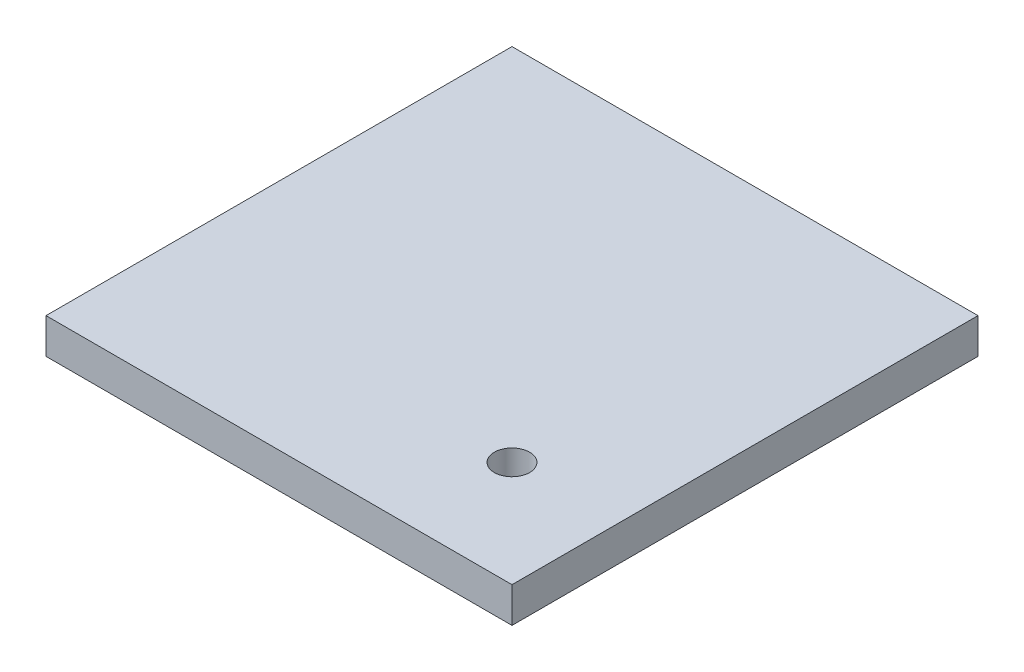
ISO-10303-21;
HEADER;
FILE_DESCRIPTION(('STEP AP214'),'2;1');
FILE_NAME('part.step','',(''),(''),'','','');
FILE_SCHEMA(('AUTOMOTIVE_DESIGN { 1 0 10303 214 1 1 1 1 }'));
ENDSEC;
DATA;
#1=APPLICATION_CONTEXT('core data for automotive mechanical design processes');
#2=APPLICATION_PROTOCOL_DEFINITION('international standard','automotive_design',2000,#1);
#3=PRODUCT_CONTEXT('',#1,'mechanical');
#4=PRODUCT('Part','Part','',(#3));
#5=PRODUCT_RELATED_PRODUCT_CATEGORY('part','',(#4));
#6=PRODUCT_DEFINITION_FORMATION('','',#4);
#7=PRODUCT_DEFINITION_CONTEXT('part definition',#1,'design');
#8=PRODUCT_DEFINITION('design','',#6,#7);
#9=PRODUCT_DEFINITION_SHAPE('','',#8);
#10=(LENGTH_UNIT() NAMED_UNIT(*) SI_UNIT(.MILLI.,.METRE.));
#11=(NAMED_UNIT(*) PLANE_ANGLE_UNIT() SI_UNIT($,.RADIAN.));
#12=(NAMED_UNIT(*) SI_UNIT($,.STERADIAN.) SOLID_ANGLE_UNIT());
#13=UNCERTAINTY_MEASURE_WITH_UNIT(LENGTH_MEASURE(1.E-05),#10,'distance_accuracy_value','');
#14=(GEOMETRIC_REPRESENTATION_CONTEXT(3) GLOBAL_UNCERTAINTY_ASSIGNED_CONTEXT((#13)) GLOBAL_UNIT_ASSIGNED_CONTEXT((#10,
#11,#12)) REPRESENTATION_CONTEXT('',''));
#15=CARTESIAN_POINT('',(0.,0.,0.));
#16=DIRECTION('',(0.,0.,1.));
#17=DIRECTION('',(1.,0.,0.));
#18=AXIS2_PLACEMENT_3D('',#15,#16,#17);
#19=CARTESIAN_POINT('',(0.,5.,0.));
#20=DIRECTION('',(0.,-1.,0.));
#21=DIRECTION('',(0.,0.,-1.));
#22=AXIS2_PLACEMENT_3D('',#19,#20,#21);
#23=PLANE('',#22);
#24=DIRECTION('',(0.,0.,1.));
#25=VECTOR('',#24,1.);
#26=CARTESIAN_POINT('',(0.,5.,0.));
#27=LINE('',#26,#25);
#28=CARTESIAN_POINT('',(0.,5.,-66.));
#29=VERTEX_POINT('',#28);
#30=CARTESIAN_POINT('',(0.,5.,0.));
#31=VERTEX_POINT('',#30);
#32=EDGE_CURVE('E85',#29,#31,#27,.T.);
#33=ORIENTED_EDGE('',*,*,#32,.T.);
#34=DIRECTION('',(1.,0.,0.));
#35=VECTOR('',#34,1.);
#36=CARTESIAN_POINT('',(0.,5.,0.));
#37=LINE('',#36,#35);
#38=CARTESIAN_POINT('',(66.,5.,0.));
#39=VERTEX_POINT('',#38);
#40=EDGE_CURVE('E80',#31,#39,#37,.T.);
#41=ORIENTED_EDGE('',*,*,#40,.T.);
#42=DIRECTION('',(0.,0.,-1.));
#43=VECTOR('',#42,1.);
#44=CARTESIAN_POINT('',(66.,5.,0.));
#45=LINE('',#44,#43);
#46=CARTESIAN_POINT('',(66.,5.,-66.));
#47=VERTEX_POINT('',#46);
#48=EDGE_CURVE('E83',#39,#47,#45,.T.);
#49=ORIENTED_EDGE('',*,*,#48,.T.);
#50=DIRECTION('',(-1.,0.,0.));
#51=VECTOR('',#50,1.);
#52=CARTESIAN_POINT('',(0.,5.,-66.));
#53=LINE('',#52,#51);
#54=EDGE_CURVE('E50',#47,#29,#53,.T.);
#55=ORIENTED_EDGE('',*,*,#54,.T.);
#56=EDGE_LOOP('',(#33,#41,#49,#55));
#57=FACE_BOUND('',#56,.T.);
#58=CARTESIAN_POINT('',(51.,5.,-15.));
#59=DIRECTION('',(0.,1.,0.));
#60=DIRECTION('',(0.,0.,1.));
#61=AXIS2_PLACEMENT_3D('',#58,#59,#60);
#62=CIRCLE('',#61,2.5);
#63=CARTESIAN_POINT('',(51.,5.,-12.5));
#64=VERTEX_POINT('',#63);
#65=EDGE_CURVE('E100',#64,#64,#62,.T.);
#66=ORIENTED_EDGE('',*,*,#65,.F.);
#67=EDGE_LOOP('',(#66));
#68=FACE_BOUND('',#67,.T.);
#69=ADVANCED_FACE('F33',(#57,#68),#23,.F.);
#70=CARTESIAN_POINT('',(0.,0.,0.));
#71=DIRECTION('',(0.,-1.,0.));
#72=DIRECTION('',(0.,0.,-1.));
#73=AXIS2_PLACEMENT_3D('',#70,#71,#72);
#74=PLANE('',#73);
#75=DIRECTION('',(0.,0.,1.));
#76=VECTOR('',#75,1.);
#77=CARTESIAN_POINT('',(0.,0.,0.));
#78=LINE('',#77,#76);
#79=CARTESIAN_POINT('',(0.,0.,-66.));
#80=VERTEX_POINT('',#79);
#81=CARTESIAN_POINT('',(0.,0.,0.));
#82=VERTEX_POINT('',#81);
#83=EDGE_CURVE('E97',#80,#82,#78,.T.);
#84=ORIENTED_EDGE('',*,*,#83,.F.);
#85=DIRECTION('',(-1.,0.,0.));
#86=VECTOR('',#85,1.);
#87=CARTESIAN_POINT('',(0.,0.,-66.));
#88=LINE('',#87,#86);
#89=CARTESIAN_POINT('',(66.,0.,-66.));
#90=VERTEX_POINT('',#89);
#91=EDGE_CURVE('E73',#90,#80,#88,.T.);
#92=ORIENTED_EDGE('',*,*,#91,.F.);
#93=DIRECTION('',(0.,0.,-1.));
#94=VECTOR('',#93,1.);
#95=CARTESIAN_POINT('',(66.,0.,0.));
#96=LINE('',#95,#94);
#97=CARTESIAN_POINT('',(66.,0.,0.));
#98=VERTEX_POINT('',#97);
#99=EDGE_CURVE('E67',#98,#90,#96,.T.);
#100=ORIENTED_EDGE('',*,*,#99,.F.);
#101=DIRECTION('',(1.,0.,0.));
#102=VECTOR('',#101,1.);
#103=CARTESIAN_POINT('',(0.,0.,0.));
#104=LINE('',#103,#102);
#105=EDGE_CURVE('E89',#82,#98,#104,.T.);
#106=ORIENTED_EDGE('',*,*,#105,.F.);
#107=EDGE_LOOP('',(#84,#92,#100,#106));
#108=FACE_BOUND('',#107,.T.);
#109=CARTESIAN_POINT('',(51.,0.,-15.));
#110=DIRECTION('',(0.,1.,0.));
#111=DIRECTION('',(0.,0.,1.));
#112=AXIS2_PLACEMENT_3D('',#109,#110,#111);
#113=CIRCLE('',#112,2.5);
#114=CARTESIAN_POINT('',(51.,0.,-12.5));
#115=VERTEX_POINT('',#114);
#116=EDGE_CURVE('E112',#115,#115,#113,.T.);
#117=ORIENTED_EDGE('',*,*,#116,.T.);
#118=EDGE_LOOP('',(#117));
#119=FACE_BOUND('',#118,.T.);
#120=ADVANCED_FACE('F108',(#108,#119),#74,.T.);
#121=CARTESIAN_POINT('',(0.,5.,0.));
#122=DIRECTION('',(1.,0.,0.));
#123=DIRECTION('',(0.,0.,-1.));
#124=AXIS2_PLACEMENT_3D('',#121,#122,#123);
#125=PLANE('',#124);
#126=ORIENTED_EDGE('',*,*,#83,.T.);
#127=DIRECTION('',(0.,-1.,0.));
#128=VECTOR('',#127,1.);
#129=CARTESIAN_POINT('',(0.,5.,0.));
#130=LINE('',#129,#128);
#131=EDGE_CURVE('E11',#31,#82,#130,.T.);
#132=ORIENTED_EDGE('',*,*,#131,.F.);
#133=ORIENTED_EDGE('',*,*,#32,.F.);
#134=DIRECTION('',(0.,-1.,0.));
#135=VECTOR('',#134,1.);
#136=CARTESIAN_POINT('',(0.,5.,-66.));
#137=LINE('',#136,#135);
#138=EDGE_CURVE('E93',#29,#80,#137,.T.);
#139=ORIENTED_EDGE('',*,*,#138,.T.);
#140=EDGE_LOOP('',(#126,#132,#133,#139));
#141=FACE_BOUND('',#140,.T.);
#142=ADVANCED_FACE('F35',(#141),#125,.F.);
#143=CARTESIAN_POINT('',(0.,5.,0.));
#144=DIRECTION('',(0.,0.,-1.));
#145=DIRECTION('',(-1.,0.,0.));
#146=AXIS2_PLACEMENT_3D('',#143,#144,#145);
#147=PLANE('',#146);
#148=ORIENTED_EDGE('',*,*,#105,.T.);
#149=DIRECTION('',(0.,-1.,0.));
#150=VECTOR('',#149,1.);
#151=CARTESIAN_POINT('',(66.,5.,0.));
#152=LINE('',#151,#150);
#153=EDGE_CURVE('E42',#39,#98,#152,.T.);
#154=ORIENTED_EDGE('',*,*,#153,.F.);
#155=ORIENTED_EDGE('',*,*,#40,.F.);
#156=ORIENTED_EDGE('',*,*,#131,.T.);
#157=EDGE_LOOP('',(#148,#154,#155,#156));
#158=FACE_BOUND('',#157,.T.);
#159=ADVANCED_FACE('F88',(#158),#147,.F.);
#160=CARTESIAN_POINT('',(66.,5.,0.));
#161=DIRECTION('',(-1.,0.,0.));
#162=DIRECTION('',(0.,0.,1.));
#163=AXIS2_PLACEMENT_3D('',#160,#161,#162);
#164=PLANE('',#163);
#165=ORIENTED_EDGE('',*,*,#99,.T.);
#166=DIRECTION('',(0.,-1.,0.));
#167=VECTOR('',#166,1.);
#168=CARTESIAN_POINT('',(66.,5.,-66.));
#169=LINE('',#168,#167);
#170=EDGE_CURVE('E90',#47,#90,#169,.T.);
#171=ORIENTED_EDGE('',*,*,#170,.F.);
#172=ORIENTED_EDGE('',*,*,#48,.F.);
#173=ORIENTED_EDGE('',*,*,#153,.T.);
#174=EDGE_LOOP('',(#165,#171,#172,#173));
#175=FACE_BOUND('',#174,.T.);
#176=ADVANCED_FACE('F91',(#175),#164,.F.);
#177=CARTESIAN_POINT('',(0.,5.,-66.));
#178=DIRECTION('',(0.,0.,1.));
#179=DIRECTION('',(1.,0.,0.));
#180=AXIS2_PLACEMENT_3D('',#177,#178,#179);
#181=PLANE('',#180);
#182=ORIENTED_EDGE('',*,*,#91,.T.);
#183=ORIENTED_EDGE('',*,*,#138,.F.);
#184=ORIENTED_EDGE('',*,*,#54,.F.);
#185=ORIENTED_EDGE('',*,*,#170,.T.);
#186=EDGE_LOOP('',(#182,#183,#184,#185));
#187=FACE_BOUND('',#186,.T.);
#188=ADVANCED_FACE('F105',(#187),#181,.F.);
#189=CARTESIAN_POINT('',(51.,5.,-15.));
#190=DIRECTION('',(0.,-1.,0.));
#191=DIRECTION('',(0.,0.,-1.));
#192=AXIS2_PLACEMENT_3D('',#189,#190,#191);
#193=CYLINDRICAL_SURFACE('',#192,2.5);
#194=ORIENTED_EDGE('',*,*,#65,.T.);
#195=EDGE_LOOP('',(#194));
#196=FACE_BOUND('',#195,.T.);
#197=ORIENTED_EDGE('',*,*,#116,.F.);
#198=EDGE_LOOP('',(#197));
#199=FACE_BOUND('',#198,.T.);
#200=ADVANCED_FACE('F118',(#196,#199),#193,.F.);
#201=CLOSED_SHELL('',(#69,#120,#142,#159,#176,#188,#200));
#202=MANIFOLD_SOLID_BREP('B2',#201);
#203=ADVANCED_BREP_SHAPE_REPRESENTATION('',(#18,#202),#14);
#204=SHAPE_DEFINITION_REPRESENTATION(#9,#203);
ENDSEC;
END-ISO-10303-21;
